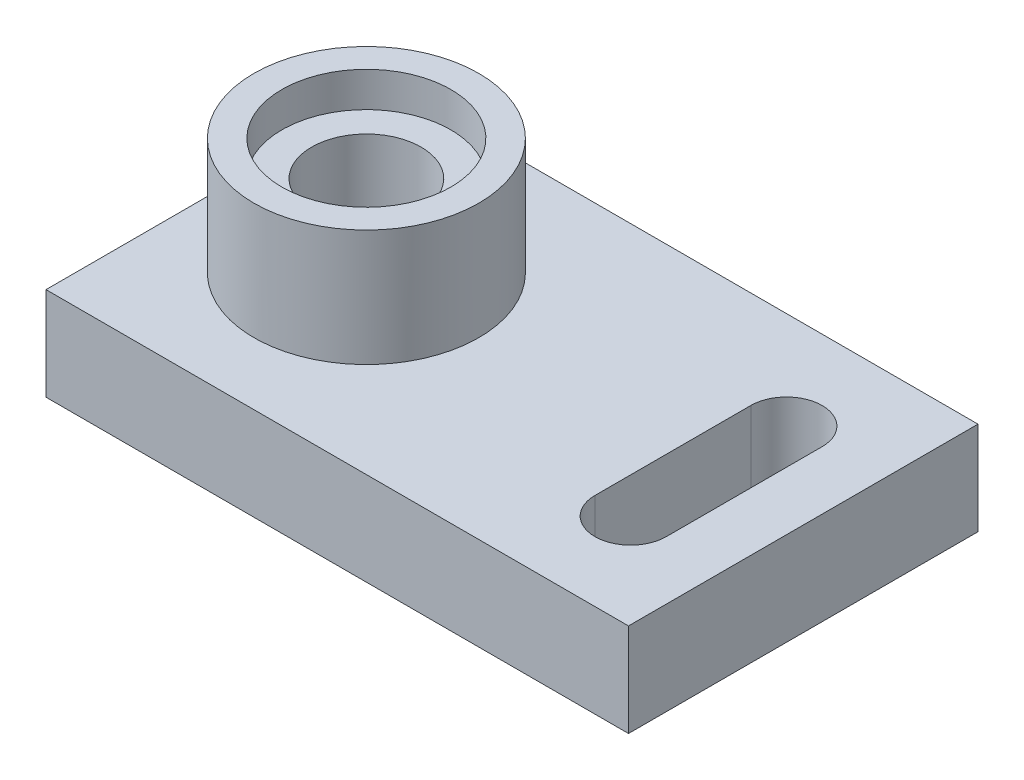
ISO-10303-21;
HEADER;
FILE_DESCRIPTION(('STEP AP214'),'2;1');
FILE_NAME('part.step','',(''),(''),'','','');
FILE_SCHEMA(('AUTOMOTIVE_DESIGN { 1 0 10303 214 1 1 1 1 }'));
ENDSEC;
DATA;
#1=APPLICATION_CONTEXT('core data for automotive mechanical design processes');
#2=APPLICATION_PROTOCOL_DEFINITION('international standard','automotive_design',2000,#1);
#3=PRODUCT_CONTEXT('',#1,'mechanical');
#4=PRODUCT('Part','Part','',(#3));
#5=PRODUCT_RELATED_PRODUCT_CATEGORY('part','',(#4));
#6=PRODUCT_DEFINITION_FORMATION('','',#4);
#7=PRODUCT_DEFINITION_CONTEXT('part definition',#1,'design');
#8=PRODUCT_DEFINITION('design','',#6,#7);
#9=PRODUCT_DEFINITION_SHAPE('','',#8);
#10=(LENGTH_UNIT() NAMED_UNIT(*) SI_UNIT(.MILLI.,.METRE.));
#11=(NAMED_UNIT(*) PLANE_ANGLE_UNIT() SI_UNIT($,.RADIAN.));
#12=(NAMED_UNIT(*) SI_UNIT($,.STERADIAN.) SOLID_ANGLE_UNIT());
#13=UNCERTAINTY_MEASURE_WITH_UNIT(LENGTH_MEASURE(1.E-05),#10,'distance_accuracy_value','');
#14=(GEOMETRIC_REPRESENTATION_CONTEXT(3) GLOBAL_UNCERTAINTY_ASSIGNED_CONTEXT((#13)) GLOBAL_UNIT_ASSIGNED_CONTEXT((#10,
#11,#12)) REPRESENTATION_CONTEXT('',''));
#15=CARTESIAN_POINT('',(0.,0.,0.));
#16=DIRECTION('',(0.,0.,1.));
#17=DIRECTION('',(1.,0.,0.));
#18=AXIS2_PLACEMENT_3D('',#15,#16,#17);
#19=CARTESIAN_POINT('',(31.75,0.,-38.1));
#20=DIRECTION('',(0.,1.,0.));
#21=DIRECTION('',(0.,0.,1.));
#22=AXIS2_PLACEMENT_3D('',#19,#20,#21);
#23=CYLINDRICAL_SURFACE('',#22,11.9314073147491);
#24=CARTESIAN_POINT('',(31.75,0.,-38.1));
#25=DIRECTION('',(0.,1.,0.));
#26=DIRECTION('',(0.,0.,1.));
#27=AXIS2_PLACEMENT_3D('',#24,#25,#26);
#28=CIRCLE('',#27,11.9314073147491);
#29=CARTESIAN_POINT('',(31.75,0.,-26.1685926852509));
#30=VERTEX_POINT('',#29);
#31=EDGE_CURVE('E287',#30,#30,#28,.T.);
#32=ORIENTED_EDGE('',*,*,#31,.F.);
#33=EDGE_LOOP('',(#32));
#34=FACE_BOUND('',#33,.T.);
#35=CARTESIAN_POINT('',(31.75,38.1,-38.1));
#36=DIRECTION('',(0.,1.,0.));
#37=DIRECTION('',(0.,0.,1.));
#38=AXIS2_PLACEMENT_3D('',#35,#36,#37);
#39=CIRCLE('',#38,11.9314073147491);
#40=CARTESIAN_POINT('',(31.75,38.1,-26.1685926852509));
#41=VERTEX_POINT('',#40);
#42=EDGE_CURVE('E63',#41,#41,#39,.F.);
#43=ORIENTED_EDGE('',*,*,#42,.F.);
#44=EDGE_LOOP('',(#43));
#45=FACE_BOUND('',#44,.T.);
#46=ADVANCED_FACE('F59',(#34,#45),#23,.F.);
#47=CARTESIAN_POINT('',(127.,20.32,-76.2));
#48=DIRECTION('',(1.,0.,0.));
#49=DIRECTION('',(0.,0.,-1.));
#50=AXIS2_PLACEMENT_3D('',#47,#48,#49);
#51=PLANE('',#50);
#52=DIRECTION('',(0.,0.,1.));
#53=VECTOR('',#52,1.);
#54=CARTESIAN_POINT('',(127.,0.,-76.2));
#55=LINE('',#54,#53);
#56=CARTESIAN_POINT('',(127.,0.,-76.2));
#57=VERTEX_POINT('',#56);
#58=CARTESIAN_POINT('',(127.,0.,0.));
#59=VERTEX_POINT('',#58);
#60=EDGE_CURVE('E174',#57,#59,#55,.T.);
#61=ORIENTED_EDGE('',*,*,#60,.F.);
#62=DIRECTION('',(0.,-1.,0.));
#63=VECTOR('',#62,1.);
#64=CARTESIAN_POINT('',(127.,20.32,-76.2));
#65=LINE('',#64,#63);
#66=CARTESIAN_POINT('',(127.,20.32,-76.2));
#67=VERTEX_POINT('',#66);
#68=EDGE_CURVE('E69',#67,#57,#65,.T.);
#69=ORIENTED_EDGE('',*,*,#68,.F.);
#70=DIRECTION('',(0.,0.,1.));
#71=VECTOR('',#70,1.);
#72=CARTESIAN_POINT('',(127.,20.32,-76.2));
#73=LINE('',#72,#71);
#74=CARTESIAN_POINT('',(127.,20.32,0.));
#75=VERTEX_POINT('',#74);
#76=EDGE_CURVE('E180',#67,#75,#73,.T.);
#77=ORIENTED_EDGE('',*,*,#76,.T.);
#78=DIRECTION('',(0.,-1.,0.));
#79=VECTOR('',#78,1.);
#80=CARTESIAN_POINT('',(127.,20.32,0.));
#81=LINE('',#80,#79);
#82=EDGE_CURVE('E197',#75,#59,#81,.T.);
#83=ORIENTED_EDGE('',*,*,#82,.T.);
#84=EDGE_LOOP('',(#61,#69,#77,#83));
#85=FACE_BOUND('',#84,.T.);
#86=ADVANCED_FACE('F61',(#85),#51,.T.);
#87=CARTESIAN_POINT('',(0.,20.32,-76.2));
#88=DIRECTION('',(0.,0.,-1.));
#89=DIRECTION('',(-1.,0.,0.));
#90=AXIS2_PLACEMENT_3D('',#87,#88,#89);
#91=PLANE('',#90);
#92=DIRECTION('',(1.,0.,0.));
#93=VECTOR('',#92,1.);
#94=CARTESIAN_POINT('',(0.,0.,-76.2));
#95=LINE('',#94,#93);
#96=CARTESIAN_POINT('',(0.,0.,-76.2));
#97=VERTEX_POINT('',#96);
#98=EDGE_CURVE('E185',#97,#57,#95,.T.);
#99=ORIENTED_EDGE('',*,*,#98,.F.);
#100=DIRECTION('',(0.,-1.,0.));
#101=VECTOR('',#100,1.);
#102=CARTESIAN_POINT('',(0.,20.32,-76.2));
#103=LINE('',#102,#101);
#104=CARTESIAN_POINT('',(0.,20.32,-76.2));
#105=VERTEX_POINT('',#104);
#106=EDGE_CURVE('E214',#105,#97,#103,.T.);
#107=ORIENTED_EDGE('',*,*,#106,.F.);
#108=DIRECTION('',(1.,0.,0.));
#109=VECTOR('',#108,1.);
#110=CARTESIAN_POINT('',(0.,20.32,-76.2));
#111=LINE('',#110,#109);
#112=EDGE_CURVE('E193',#105,#67,#111,.T.);
#113=ORIENTED_EDGE('',*,*,#112,.T.);
#114=ORIENTED_EDGE('',*,*,#68,.T.);
#115=EDGE_LOOP('',(#99,#107,#113,#114));
#116=FACE_BOUND('',#115,.T.);
#117=ADVANCED_FACE('F233',(#116),#91,.T.);
#118=CARTESIAN_POINT('',(0.,20.32,0.));
#119=DIRECTION('',(-1.,0.,0.));
#120=DIRECTION('',(0.,0.,1.));
#121=AXIS2_PLACEMENT_3D('',#118,#119,#120);
#122=PLANE('',#121);
#123=DIRECTION('',(0.,0.,-1.));
#124=VECTOR('',#123,1.);
#125=CARTESIAN_POINT('',(0.,0.,0.));
#126=LINE('',#125,#124);
#127=CARTESIAN_POINT('',(0.,0.,0.));
#128=VERTEX_POINT('',#127);
#129=EDGE_CURVE('E205',#128,#97,#126,.T.);
#130=ORIENTED_EDGE('',*,*,#129,.F.);
#131=DIRECTION('',(0.,-1.,0.));
#132=VECTOR('',#131,1.);
#133=CARTESIAN_POINT('',(0.,20.32,0.));
#134=LINE('',#133,#132);
#135=CARTESIAN_POINT('',(0.,20.32,0.));
#136=VERTEX_POINT('',#135);
#137=EDGE_CURVE('E217',#136,#128,#134,.T.);
#138=ORIENTED_EDGE('',*,*,#137,.F.);
#139=DIRECTION('',(0.,0.,-1.));
#140=VECTOR('',#139,1.);
#141=CARTESIAN_POINT('',(0.,20.32,0.));
#142=LINE('',#141,#140);
#143=EDGE_CURVE('E189',#136,#105,#142,.T.);
#144=ORIENTED_EDGE('',*,*,#143,.T.);
#145=ORIENTED_EDGE('',*,*,#106,.T.);
#146=EDGE_LOOP('',(#130,#138,#144,#145));
#147=FACE_BOUND('',#146,.T.);
#148=ADVANCED_FACE('F239',(#147),#122,.T.);
#149=CARTESIAN_POINT('',(127.,20.32,0.));
#150=DIRECTION('',(0.,0.,1.));
#151=DIRECTION('',(1.,0.,0.));
#152=AXIS2_PLACEMENT_3D('',#149,#150,#151);
#153=PLANE('',#152);
#154=DIRECTION('',(-1.,0.,0.));
#155=VECTOR('',#154,1.);
#156=CARTESIAN_POINT('',(127.,0.,0.));
#157=LINE('',#156,#155);
#158=EDGE_CURVE('E201',#59,#128,#157,.T.);
#159=ORIENTED_EDGE('',*,*,#158,.F.);
#160=ORIENTED_EDGE('',*,*,#82,.F.);
#161=DIRECTION('',(-1.,0.,0.));
#162=VECTOR('',#161,1.);
#163=CARTESIAN_POINT('',(127.,20.32,0.));
#164=LINE('',#163,#162);
#165=EDGE_CURVE('E184',#75,#136,#164,.T.);
#166=ORIENTED_EDGE('',*,*,#165,.T.);
#167=ORIENTED_EDGE('',*,*,#137,.T.);
#168=EDGE_LOOP('',(#159,#160,#166,#167));
#169=FACE_BOUND('',#168,.T.);
#170=ADVANCED_FACE('F229',(#169),#153,.T.);
#171=CARTESIAN_POINT('',(0.,20.32,0.));
#172=DIRECTION('',(0.,-1.,0.));
#173=DIRECTION('',(0.,0.,-1.));
#174=AXIS2_PLACEMENT_3D('',#171,#172,#173);
#175=PLANE('',#174);
#176=CARTESIAN_POINT('',(31.75,20.32,-38.1));
#177=DIRECTION('',(0.,-1.,0.));
#178=DIRECTION('',(0.,0.,-1.));
#179=AXIS2_PLACEMENT_3D('',#176,#177,#178);
#180=CIRCLE('',#179,24.515114189071);
#181=CARTESIAN_POINT('',(31.75,20.32,-62.615114189071));
#182=VERTEX_POINT('',#181);
#183=EDGE_CURVE('E13',#182,#182,#180,.F.);
#184=ORIENTED_EDGE('',*,*,#183,.F.);
#185=EDGE_LOOP('',(#184));
#186=FACE_BOUND('',#185,.T.);
#187=DIRECTION('',(0.,0.,-1.));
#188=VECTOR('',#187,1.);
#189=CARTESIAN_POINT('',(114.265162166642,20.32,-20.9735810432433));
#190=LINE('',#189,#188);
#191=CARTESIAN_POINT('',(114.265162166642,20.32,-20.9735810432433));
#192=VERTEX_POINT('',#191);
#193=CARTESIAN_POINT('',(114.265162166642,20.32,-54.9534879773663));
#194=VERTEX_POINT('',#193);
#195=EDGE_CURVE('E165',#192,#194,#190,.T.);
#196=ORIENTED_EDGE('',*,*,#195,.F.);
#197=CARTESIAN_POINT('',(106.486629254011,20.32,-20.9735810432433));
#198=DIRECTION('',(0.,1.,0.));
#199=DIRECTION('',(0.,0.,1.));
#200=AXIS2_PLACEMENT_3D('',#197,#198,#199);
#201=CIRCLE('',#200,7.77853291263059);
#202=CARTESIAN_POINT('',(98.7080963413805,20.32,-20.9735810432433));
#203=VERTEX_POINT('',#202);
#204=EDGE_CURVE('E76',#203,#192,#201,.T.);
#205=ORIENTED_EDGE('',*,*,#204,.F.);
#206=DIRECTION('',(0.,0.,1.));
#207=VECTOR('',#206,1.);
#208=CARTESIAN_POINT('',(98.7080963413805,20.32,-20.9735810432433));
#209=LINE('',#208,#207);
#210=CARTESIAN_POINT('',(98.7080963413805,20.32,-54.9534879773663));
#211=VERTEX_POINT('',#210);
#212=EDGE_CURVE('E147',#211,#203,#209,.T.);
#213=ORIENTED_EDGE('',*,*,#212,.F.);
#214=CARTESIAN_POINT('',(106.486629254011,20.32,-54.9534879773663));
#215=DIRECTION('',(0.,1.,0.));
#216=DIRECTION('',(0.,0.,1.));
#217=AXIS2_PLACEMENT_3D('',#214,#215,#216);
#218=CIRCLE('',#217,7.77853291263059);
#219=EDGE_CURVE('E153',#194,#211,#218,.T.);
#220=ORIENTED_EDGE('',*,*,#219,.F.);
#221=EDGE_LOOP('',(#196,#205,#213,#220));
#222=FACE_BOUND('',#221,.T.);
#223=ORIENTED_EDGE('',*,*,#76,.F.);
#224=ORIENTED_EDGE('',*,*,#112,.F.);
#225=ORIENTED_EDGE('',*,*,#143,.F.);
#226=ORIENTED_EDGE('',*,*,#165,.F.);
#227=EDGE_LOOP('',(#223,#224,#225,#226));
#228=FACE_BOUND('',#227,.T.);
#229=ADVANCED_FACE('F236',(#186,#222,#228),#175,.F.);
#230=CARTESIAN_POINT('',(0.,0.,0.));
#231=DIRECTION('',(0.,-1.,0.));
#232=DIRECTION('',(0.,0.,-1.));
#233=AXIS2_PLACEMENT_3D('',#230,#231,#232);
#234=PLANE('',#233);
#235=ORIENTED_EDGE('',*,*,#31,.T.);
#236=EDGE_LOOP('',(#235));
#237=FACE_BOUND('',#236,.T.);
#238=CARTESIAN_POINT('',(106.486629254011,0.,-20.9735810432433));
#239=DIRECTION('',(0.,1.,0.));
#240=DIRECTION('',(0.,0.,1.));
#241=AXIS2_PLACEMENT_3D('',#238,#239,#240);
#242=CIRCLE('',#241,7.77853291263059);
#243=CARTESIAN_POINT('',(98.7080963413805,0.,-20.9735810432433));
#244=VERTEX_POINT('',#243);
#245=CARTESIAN_POINT('',(114.265162166642,0.,-20.9735810432433));
#246=VERTEX_POINT('',#245);
#247=EDGE_CURVE('E128',#244,#246,#242,.T.);
#248=ORIENTED_EDGE('',*,*,#247,.T.);
#249=DIRECTION('',(0.,0.,-1.));
#250=VECTOR('',#249,1.);
#251=CARTESIAN_POINT('',(114.265162166642,0.,-20.9735810432433));
#252=LINE('',#251,#250);
#253=CARTESIAN_POINT('',(114.265162166642,0.,-54.9534879773663));
#254=VERTEX_POINT('',#253);
#255=EDGE_CURVE('E138',#246,#254,#252,.T.);
#256=ORIENTED_EDGE('',*,*,#255,.T.);
#257=CARTESIAN_POINT('',(106.486629254011,0.,-54.9534879773663));
#258=DIRECTION('',(0.,1.,0.));
#259=DIRECTION('',(0.,0.,1.));
#260=AXIS2_PLACEMENT_3D('',#257,#258,#259);
#261=CIRCLE('',#260,7.77853291263059);
#262=CARTESIAN_POINT('',(98.7080963413805,0.,-54.9534879773663));
#263=VERTEX_POINT('',#262);
#264=EDGE_CURVE('E84',#254,#263,#261,.T.);
#265=ORIENTED_EDGE('',*,*,#264,.T.);
#266=DIRECTION('',(0.,0.,1.));
#267=VECTOR('',#266,1.);
#268=CARTESIAN_POINT('',(98.7080963413805,0.,-20.9735810432433));
#269=LINE('',#268,#267);
#270=EDGE_CURVE('E135',#263,#244,#269,.T.);
#271=ORIENTED_EDGE('',*,*,#270,.T.);
#272=EDGE_LOOP('',(#248,#256,#265,#271));
#273=FACE_BOUND('',#272,.T.);
#274=ORIENTED_EDGE('',*,*,#60,.T.);
#275=ORIENTED_EDGE('',*,*,#158,.T.);
#276=ORIENTED_EDGE('',*,*,#129,.T.);
#277=ORIENTED_EDGE('',*,*,#98,.T.);
#278=EDGE_LOOP('',(#274,#275,#276,#277));
#279=FACE_BOUND('',#278,.T.);
#280=ADVANCED_FACE('F143',(#237,#273,#279),#234,.T.);
#281=CARTESIAN_POINT('',(106.486629254011,0.,-20.9735810432433));
#282=DIRECTION('',(0.,1.,0.));
#283=DIRECTION('',(0.,0.,1.));
#284=AXIS2_PLACEMENT_3D('',#281,#282,#283);
#285=CYLINDRICAL_SURFACE('',#284,7.77853291263059);
#286=ORIENTED_EDGE('',*,*,#204,.T.);
#287=DIRECTION('',(0.,1.,0.));
#288=VECTOR('',#287,1.);
#289=CARTESIAN_POINT('',(114.265162166642,0.,-20.9735810432433));
#290=LINE('',#289,#288);
#291=EDGE_CURVE('E124',#246,#192,#290,.T.);
#292=ORIENTED_EDGE('',*,*,#291,.F.);
#293=ORIENTED_EDGE('',*,*,#247,.F.);
#294=DIRECTION('',(0.,1.,0.));
#295=VECTOR('',#294,1.);
#296=CARTESIAN_POINT('',(98.7080963413805,0.,-20.9735810432433));
#297=LINE('',#296,#295);
#298=EDGE_CURVE('E171',#244,#203,#297,.T.);
#299=ORIENTED_EDGE('',*,*,#298,.T.);
#300=EDGE_LOOP('',(#286,#292,#293,#299));
#301=FACE_BOUND('',#300,.T.);
#302=ADVANCED_FACE('F126',(#301),#285,.F.);
#303=CARTESIAN_POINT('',(98.7080963413805,0.,-20.9735810432433));
#304=DIRECTION('',(-1.,0.,0.));
#305=DIRECTION('',(0.,0.,1.));
#306=AXIS2_PLACEMENT_3D('',#303,#304,#305);
#307=PLANE('',#306);
#308=ORIENTED_EDGE('',*,*,#212,.T.);
#309=ORIENTED_EDGE('',*,*,#298,.F.);
#310=ORIENTED_EDGE('',*,*,#270,.F.);
#311=DIRECTION('',(0.,1.,0.));
#312=VECTOR('',#311,1.);
#313=CARTESIAN_POINT('',(98.7080963413805,0.,-54.9534879773663));
#314=LINE('',#313,#312);
#315=EDGE_CURVE('E175',#263,#211,#314,.T.);
#316=ORIENTED_EDGE('',*,*,#315,.T.);
#317=EDGE_LOOP('',(#308,#309,#310,#316));
#318=FACE_BOUND('',#317,.T.);
#319=ADVANCED_FACE('F269',(#318),#307,.F.);
#320=CARTESIAN_POINT('',(106.486629254011,0.,-54.9534879773663));
#321=DIRECTION('',(0.,1.,0.));
#322=DIRECTION('',(0.,0.,1.));
#323=AXIS2_PLACEMENT_3D('',#320,#321,#322);
#324=CYLINDRICAL_SURFACE('',#323,7.77853291263059);
#325=ORIENTED_EDGE('',*,*,#219,.T.);
#326=ORIENTED_EDGE('',*,*,#315,.F.);
#327=ORIENTED_EDGE('',*,*,#264,.F.);
#328=DIRECTION('',(0.,1.,0.));
#329=VECTOR('',#328,1.);
#330=CARTESIAN_POINT('',(114.265162166642,0.,-54.9534879773663));
#331=LINE('',#330,#329);
#332=EDGE_CURVE('E134',#254,#194,#331,.T.);
#333=ORIENTED_EDGE('',*,*,#332,.T.);
#334=EDGE_LOOP('',(#325,#326,#327,#333));
#335=FACE_BOUND('',#334,.T.);
#336=ADVANCED_FACE('F272',(#335),#324,.F.);
#337=CARTESIAN_POINT('',(114.265162166642,0.,-20.9735810432433));
#338=DIRECTION('',(1.,0.,0.));
#339=DIRECTION('',(0.,0.,-1.));
#340=AXIS2_PLACEMENT_3D('',#337,#338,#339);
#341=PLANE('',#340);
#342=ORIENTED_EDGE('',*,*,#195,.T.);
#343=ORIENTED_EDGE('',*,*,#332,.F.);
#344=ORIENTED_EDGE('',*,*,#255,.F.);
#345=ORIENTED_EDGE('',*,*,#291,.T.);
#346=EDGE_LOOP('',(#342,#343,#344,#345));
#347=FACE_BOUND('',#346,.T.);
#348=ADVANCED_FACE('F139',(#347),#341,.F.);
#349=CARTESIAN_POINT('',(31.75,45.72,-38.1));
#350=DIRECTION('',(0.,-1.,0.));
#351=DIRECTION('',(0.,0.,-1.));
#352=AXIS2_PLACEMENT_3D('',#349,#350,#351);
#353=CYLINDRICAL_SURFACE('',#352,24.515114189071);
#354=CARTESIAN_POINT('',(31.75,45.72,-38.1));
#355=DIRECTION('',(0.,1.,0.));
#356=DIRECTION('',(0.,0.,1.));
#357=AXIS2_PLACEMENT_3D('',#354,#355,#356);
#358=CIRCLE('',#357,24.515114189071);
#359=CARTESIAN_POINT('',(31.75,45.72,-13.584885810929));
#360=VERTEX_POINT('',#359);
#361=EDGE_CURVE('E156',#360,#360,#358,.T.);
#362=ORIENTED_EDGE('',*,*,#361,.F.);
#363=EDGE_LOOP('',(#362));
#364=FACE_BOUND('',#363,.T.);
#365=ORIENTED_EDGE('',*,*,#183,.T.);
#366=EDGE_LOOP('',(#365));
#367=FACE_BOUND('',#366,.T.);
#368=ADVANCED_FACE('F264',(#364,#367),#353,.T.);
#369=CARTESIAN_POINT('',(31.75,45.72,-38.1));
#370=DIRECTION('',(0.,1.,0.));
#371=DIRECTION('',(0.,0.,1.));
#372=AXIS2_PLACEMENT_3D('',#369,#370,#371);
#373=PLANE('',#372);
#374=CARTESIAN_POINT('',(31.75,45.72,-38.1));
#375=DIRECTION('',(0.,1.,0.));
#376=DIRECTION('',(0.,0.,1.));
#377=AXIS2_PLACEMENT_3D('',#374,#375,#376);
#378=CIRCLE('',#377,18.4305926433857);
#379=CARTESIAN_POINT('',(31.75,45.72,-19.6694073566143));
#380=VERTEX_POINT('',#379);
#381=EDGE_CURVE('E297',#380,#380,#378,.T.);
#382=ORIENTED_EDGE('',*,*,#381,.F.);
#383=EDGE_LOOP('',(#382));
#384=FACE_BOUND('',#383,.T.);
#385=ORIENTED_EDGE('',*,*,#361,.T.);
#386=EDGE_LOOP('',(#385));
#387=FACE_BOUND('',#386,.T.);
#388=ADVANCED_FACE('F261',(#384,#387),#373,.T.);
#389=CARTESIAN_POINT('',(31.75,38.1,-38.1));
#390=DIRECTION('',(0.,1.,0.));
#391=DIRECTION('',(0.,0.,1.));
#392=AXIS2_PLACEMENT_3D('',#389,#390,#391);
#393=PLANE('',#392);
#394=CARTESIAN_POINT('',(31.75,38.1,-38.1));
#395=DIRECTION('',(0.,1.,0.));
#396=DIRECTION('',(0.,0.,1.));
#397=AXIS2_PLACEMENT_3D('',#394,#395,#396);
#398=CIRCLE('',#397,18.4305926433857);
#399=CARTESIAN_POINT('',(31.75,38.1,-19.6694073566143));
#400=VERTEX_POINT('',#399);
#401=EDGE_CURVE('E295',#400,#400,#398,.T.);
#402=ORIENTED_EDGE('',*,*,#401,.T.);
#403=EDGE_LOOP('',(#402));
#404=FACE_BOUND('',#403,.T.);
#405=ORIENTED_EDGE('',*,*,#42,.T.);
#406=EDGE_LOOP('',(#405));
#407=FACE_BOUND('',#406,.T.);
#408=ADVANCED_FACE('F263',(#404,#407),#393,.T.);
#409=CARTESIAN_POINT('',(31.75,38.1,-38.1));
#410=DIRECTION('',(0.,1.,0.));
#411=DIRECTION('',(0.,0.,1.));
#412=AXIS2_PLACEMENT_3D('',#409,#410,#411);
#413=CYLINDRICAL_SURFACE('',#412,18.4305926433857);
#414=CARTESIAN_POINT('',(31.75,38.1,-19.6694073566143));
#415=CARTESIAN_POINT('',(31.75,38.179375,-19.6694073566143));
#416=CARTESIAN_POINT('',(31.75,38.25875,-19.6694073566143));
#417=CARTESIAN_POINT('',(31.75,38.4175,-19.6694073566143));
#418=CARTESIAN_POINT('',(31.75,38.496875,-19.6694073566143));
#419=CARTESIAN_POINT('',(31.75,38.655625,-19.6694073566143));
#420=CARTESIAN_POINT('',(31.75,38.735,-19.6694073566143));
#421=CARTESIAN_POINT('',(31.75,38.89375,-19.6694073566143));
#422=CARTESIAN_POINT('',(31.75,38.973125,-19.6694073566143));
#423=CARTESIAN_POINT('',(31.75,39.131875,-19.6694073566143));
#424=CARTESIAN_POINT('',(31.75,39.21125,-19.6694073566143));
#425=CARTESIAN_POINT('',(31.75,39.37,-19.6694073566143));
#426=CARTESIAN_POINT('',(31.75,39.449375,-19.6694073566143));
#427=CARTESIAN_POINT('',(31.75,39.608125,-19.6694073566143));
#428=CARTESIAN_POINT('',(31.75,39.6875,-19.6694073566143));
#429=CARTESIAN_POINT('',(31.75,39.84625,-19.6694073566143));
#430=CARTESIAN_POINT('',(31.75,39.925625,-19.6694073566143));
#431=CARTESIAN_POINT('',(31.75,40.084375,-19.6694073566143));
#432=CARTESIAN_POINT('',(31.75,40.16375,-19.6694073566143));
#433=CARTESIAN_POINT('',(31.75,40.3225,-19.6694073566143));
#434=CARTESIAN_POINT('',(31.75,40.401875,-19.6694073566143));
#435=CARTESIAN_POINT('',(31.75,40.560625,-19.6694073566143));
#436=CARTESIAN_POINT('',(31.75,40.64,-19.6694073566143));
#437=CARTESIAN_POINT('',(31.75,40.79875,-19.6694073566143));
#438=CARTESIAN_POINT('',(31.75,40.878125,-19.6694073566143));
#439=CARTESIAN_POINT('',(31.75,41.036875,-19.6694073566143));
#440=CARTESIAN_POINT('',(31.75,41.11625,-19.6694073566143));
#441=CARTESIAN_POINT('',(31.75,41.275,-19.6694073566143));
#442=CARTESIAN_POINT('',(31.75,41.354375,-19.6694073566143));
#443=CARTESIAN_POINT('',(31.75,41.513125,-19.6694073566143));
#444=CARTESIAN_POINT('',(31.75,41.5925,-19.6694073566143));
#445=CARTESIAN_POINT('',(31.75,41.75125,-19.6694073566143));
#446=CARTESIAN_POINT('',(31.75,41.830625,-19.6694073566143));
#447=CARTESIAN_POINT('',(31.75,41.989375,-19.6694073566143));
#448=CARTESIAN_POINT('',(31.75,42.06875,-19.6694073566143));
#449=CARTESIAN_POINT('',(31.75,42.2275,-19.6694073566143));
#450=CARTESIAN_POINT('',(31.75,42.306875,-19.6694073566143));
#451=CARTESIAN_POINT('',(31.75,42.465625,-19.6694073566143));
#452=CARTESIAN_POINT('',(31.75,42.545,-19.6694073566143));
#453=CARTESIAN_POINT('',(31.75,42.70375,-19.6694073566143));
#454=CARTESIAN_POINT('',(31.75,42.783125,-19.6694073566143));
#455=CARTESIAN_POINT('',(31.75,42.941875,-19.6694073566143));
#456=CARTESIAN_POINT('',(31.75,43.02125,-19.6694073566143));
#457=CARTESIAN_POINT('',(31.75,43.18,-19.6694073566143));
#458=CARTESIAN_POINT('',(31.75,43.259375,-19.6694073566143));
#459=CARTESIAN_POINT('',(31.75,43.418125,-19.6694073566143));
#460=CARTESIAN_POINT('',(31.75,43.4975,-19.6694073566143));
#461=CARTESIAN_POINT('',(31.75,43.65625,-19.6694073566143));
#462=CARTESIAN_POINT('',(31.75,43.735625,-19.6694073566143));
#463=CARTESIAN_POINT('',(31.75,43.894375,-19.6694073566143));
#464=CARTESIAN_POINT('',(31.75,43.97375,-19.6694073566143));
#465=CARTESIAN_POINT('',(31.75,44.1325,-19.6694073566143));
#466=CARTESIAN_POINT('',(31.75,44.211875,-19.6694073566143));
#467=CARTESIAN_POINT('',(31.75,44.370625,-19.6694073566143));
#468=CARTESIAN_POINT('',(31.75,44.45,-19.6694073566143));
#469=CARTESIAN_POINT('',(31.75,44.60875,-19.6694073566143));
#470=CARTESIAN_POINT('',(31.75,44.688125,-19.6694073566143));
#471=CARTESIAN_POINT('',(31.75,44.846875,-19.6694073566143));
#472=CARTESIAN_POINT('',(31.75,44.92625,-19.6694073566143));
#473=CARTESIAN_POINT('',(31.75,45.085,-19.6694073566143));
#474=CARTESIAN_POINT('',(31.75,45.164375,-19.6694073566143));
#475=CARTESIAN_POINT('',(31.75,45.323125,-19.6694073566143));
#476=CARTESIAN_POINT('',(31.75,45.4025,-19.6694073566143));
#477=CARTESIAN_POINT('',(31.75,45.56125,-19.6694073566143));
#478=CARTESIAN_POINT('',(31.75,45.640625,-19.6694073566143));
#479=CARTESIAN_POINT('',(31.75,45.72,-19.6694073566143));
#480=B_SPLINE_CURVE_WITH_KNOTS('',3,(#414,#415,#416,#417,#418,#419,#420,#421,#422,#423,#424,
#425,#426,#427,#428,#429,#430,#431,#432,#433,#434,#435,#436,#437,#438,#439,#440,#441,#442,#443,
#444,#445,#446,#447,#448,#449,#450,#451,#452,#453,#454,#455,#456,#457,#458,#459,#460,#461,#462,
#463,#464,#465,#466,#467,#468,#469,#470,#471,#472,#473,#474,#475,#476,#477,#478,#479),
.UNSPECIFIED.,.F.,.F.,(4,2,2,2,2,2,2,2,2,2,2,2,2,2,2,2,2,2,2,2,2,2,2,2,2,2,2,2,2,2,2,2,4),(0.,
0.238124999999999,0.476249999999998,0.714374999999996,0.952499999999995,1.19062499999999,
1.42875,1.666875,1.905,2.143125,2.38124999999999,2.61937499999999,2.8575,3.095625,3.33375,
3.571875,3.80999999999999,4.048125,4.28625,4.524375,4.7625,5.00062499999999,5.23875,5.476875,
5.715,5.953125,6.19125,6.42937499999999,6.6675,6.905625,7.14375,7.381875,7.61999999999999),.UNSPECIFIED.);
#481=EDGE_CURVE('BSEAM259',#400,#380,#480,.T.);
#482=ORIENTED_EDGE('',*,*,#401,.F.);
#483=ORIENTED_EDGE('',*,*,#381,.T.);
#484=ORIENTED_EDGE('',*,*,#481,.T.);
#485=ORIENTED_EDGE('',*,*,#481,.F.);
#486=EDGE_LOOP('',(#482,#484,#483,#485));
#487=FACE_BOUND('',#486,.T.);
#488=ADVANCED_FACE('F259',(#487),#413,.F.);
#489=CLOSED_SHELL('',(#46,#86,#117,#148,#170,#229,#280,#302,#319,#336,#348,#368,#388,#408,#488));
#490=MANIFOLD_SOLID_BREP('B2',#489);
#491=ADVANCED_BREP_SHAPE_REPRESENTATION('',(#18,#490),#14);
#492=SHAPE_DEFINITION_REPRESENTATION(#9,#491);
ENDSEC;
END-ISO-10303-21;
